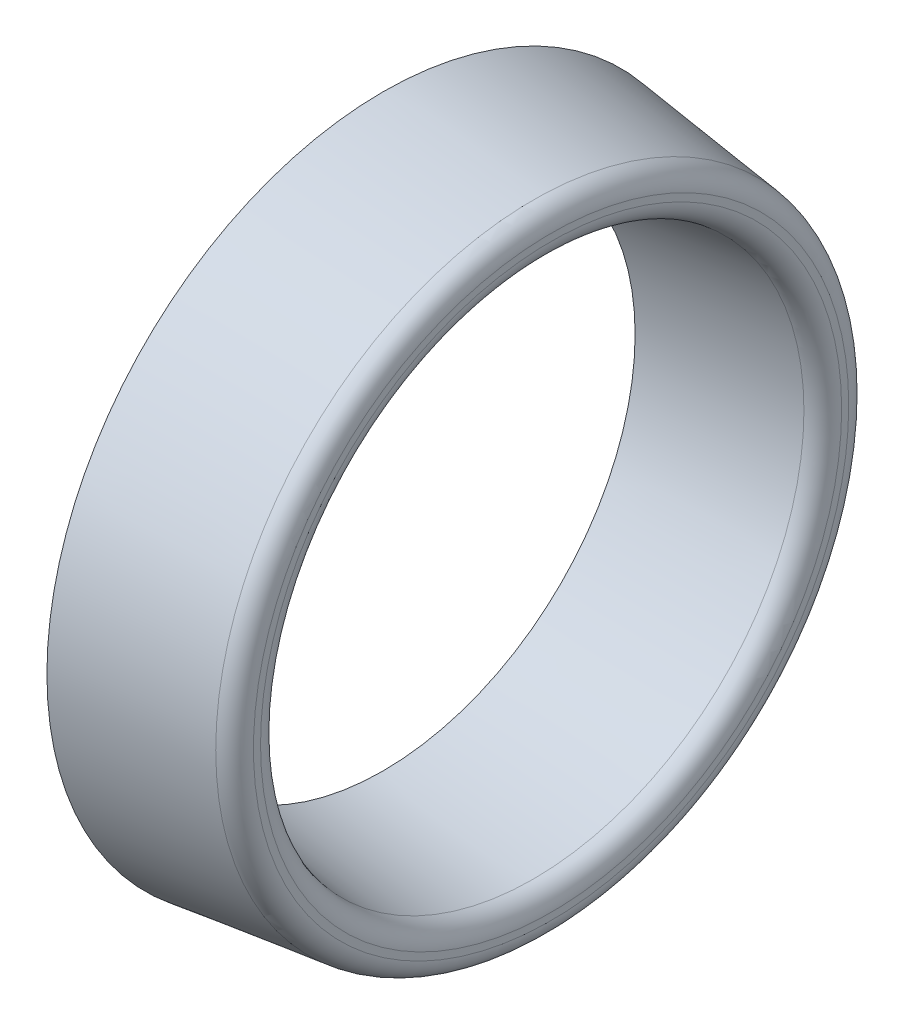
ISO-10303-21;
HEADER;
FILE_DESCRIPTION(('STEP AP214'),'2;1');
FILE_NAME('part.step','',(''),(''),'','','');
FILE_SCHEMA(('AUTOMOTIVE_DESIGN { 1 0 10303 214 1 1 1 1 }'));
ENDSEC;
DATA;
#1=APPLICATION_CONTEXT('core data for automotive mechanical design processes');
#2=APPLICATION_PROTOCOL_DEFINITION('international standard','automotive_design',2000,#1);
#3=PRODUCT_CONTEXT('',#1,'mechanical');
#4=PRODUCT('Part','Part','',(#3));
#5=PRODUCT_RELATED_PRODUCT_CATEGORY('part','',(#4));
#6=PRODUCT_DEFINITION_FORMATION('','',#4);
#7=PRODUCT_DEFINITION_CONTEXT('part definition',#1,'design');
#8=PRODUCT_DEFINITION('design','',#6,#7);
#9=PRODUCT_DEFINITION_SHAPE('','',#8);
#10=(LENGTH_UNIT() NAMED_UNIT(*) SI_UNIT(.MILLI.,.METRE.));
#11=(NAMED_UNIT(*) PLANE_ANGLE_UNIT() SI_UNIT($,.RADIAN.));
#12=(NAMED_UNIT(*) SI_UNIT($,.STERADIAN.) SOLID_ANGLE_UNIT());
#13=UNCERTAINTY_MEASURE_WITH_UNIT(LENGTH_MEASURE(1.E-05),#10,'distance_accuracy_value','');
#14=(GEOMETRIC_REPRESENTATION_CONTEXT(3) GLOBAL_UNCERTAINTY_ASSIGNED_CONTEXT((#13)) GLOBAL_UNIT_ASSIGNED_CONTEXT((#10,
#11,#12)) REPRESENTATION_CONTEXT('',''));
#15=CARTESIAN_POINT('',(0.,0.,0.));
#16=DIRECTION('',(0.,0.,1.));
#17=DIRECTION('',(1.,0.,0.));
#18=AXIS2_PLACEMENT_3D('',#15,#16,#17);
#19=CARTESIAN_POINT('',(0.,0.,0.));
#20=DIRECTION('',(1.,0.,0.));
#21=DIRECTION('',(0.,0.,-1.));
#22=AXIS2_PLACEMENT_3D('',#19,#20,#21);
#23=PLANE('',#22);
#24=CARTESIAN_POINT('',(0.,0.,0.));
#25=DIRECTION('',(1.,0.,0.));
#26=DIRECTION('',(0.,0.,-1.));
#27=AXIS2_PLACEMENT_3D('',#24,#25,#26);
#28=CIRCLE('',#27,4.7625);
#29=CARTESIAN_POINT('',(0.,0.,-4.7625));
#30=VERTEX_POINT('',#29);
#31=EDGE_CURVE('E55',#30,#30,#28,.T.);
#32=ORIENTED_EDGE('',*,*,#31,.T.);
#33=EDGE_LOOP('',(#32));
#34=FACE_BOUND('',#33,.T.);
#35=CARTESIAN_POINT('',(0.,0.,0.));
#36=DIRECTION('',(1.,0.,0.));
#37=DIRECTION('',(0.,0.,-1.));
#38=AXIS2_PLACEMENT_3D('',#35,#36,#37);
#39=CIRCLE('',#38,5.14636124349982);
#40=CARTESIAN_POINT('',(0.,0.,-5.14636124349982));
#41=VERTEX_POINT('',#40);
#42=EDGE_CURVE('E59',#41,#41,#39,.T.);
#43=ORIENTED_EDGE('',*,*,#42,.F.);
#44=EDGE_LOOP('',(#43));
#45=FACE_BOUND('',#44,.T.);
#46=ADVANCED_FACE('F32',(#34,#45),#23,.F.);
#47=CARTESIAN_POINT('',(3.175,0.,0.));
#48=DIRECTION('',(1.,0.,0.));
#49=DIRECTION('',(0.,0.,-1.));
#50=AXIS2_PLACEMENT_3D('',#47,#48,#49);
#51=PLANE('',#50);
#52=CARTESIAN_POINT('',(3.175,0.,0.));
#53=DIRECTION('',(1.,0.,0.));
#54=DIRECTION('',(0.,0.,-1.));
#55=AXIS2_PLACEMENT_3D('',#52,#53,#54);
#56=CIRCLE('',#55,5.48942130666254);
#57=CARTESIAN_POINT('',(3.175,0.,-5.48942130666254));
#58=VERTEX_POINT('',#57);
#59=EDGE_CURVE('E39',#58,#58,#56,.F.);
#60=ORIENTED_EDGE('',*,*,#59,.T.);
#61=EDGE_LOOP('',(#60));
#62=FACE_BOUND('',#61,.T.);
#63=CARTESIAN_POINT('',(3.175,0.,0.));
#64=DIRECTION('',(1.,0.,0.));
#65=DIRECTION('',(0.,0.,-1.));
#66=AXIS2_PLACEMENT_3D('',#63,#64,#65);
#67=CIRCLE('',#66,5.62307869333746);
#68=CARTESIAN_POINT('',(3.175,0.,-5.62307869333746));
#69=VERTEX_POINT('',#68);
#70=EDGE_CURVE('E43',#69,#69,#67,.T.);
#71=ORIENTED_EDGE('',*,*,#70,.T.);
#72=EDGE_LOOP('',(#71));
#73=FACE_BOUND('',#72,.T.);
#74=ADVANCED_FACE('F82',(#62,#73),#51,.T.);
#75=CARTESIAN_POINT('',(0.,0.,0.));
#76=DIRECTION('',(1.,0.,0.));
#77=DIRECTION('',(0.,0.,-1.));
#78=AXIS2_PLACEMENT_3D('',#75,#76,#77);
#79=CIRCLE('',#78,5.96613875650018);
#80=CARTESIAN_POINT('',(0.,0.,-5.96613875650018));
#81=VERTEX_POINT('',#80);
#82=EDGE_CURVE('E62',#81,#81,#79,.T.);
#83=ORIENTED_EDGE('',*,*,#82,.T.);
#84=EDGE_LOOP('',(#83));
#85=FACE_BOUND('',#84,.T.);
#86=CARTESIAN_POINT('',(0.,0.,0.));
#87=DIRECTION('',(1.,0.,0.));
#88=DIRECTION('',(0.,0.,-1.));
#89=AXIS2_PLACEMENT_3D('',#86,#87,#88);
#90=CIRCLE('',#89,6.35);
#91=CARTESIAN_POINT('',(0.,0.,-6.35));
#92=VERTEX_POINT('',#91);
#93=EDGE_CURVE('E52',#92,#92,#90,.T.);
#94=ORIENTED_EDGE('',*,*,#93,.F.);
#95=EDGE_LOOP('',(#94));
#96=FACE_BOUND('',#95,.T.);
#97=ADVANCED_FACE('F85',(#85,#96),#23,.F.);
#98=CARTESIAN_POINT('',(0.,0.,0.));
#99=DIRECTION('',(-1.,0.,0.));
#100=DIRECTION('',(0.,0.,-1.));
#101=AXIS2_PLACEMENT_3D('',#98,#99,#100);
#102=CONICAL_SURFACE('',#101,6.35,0.122173047639603);
#103=CARTESIAN_POINT('',(2.84043221983736,0.,0.));
#104=DIRECTION('',(-1.,0.,0.));
#105=DIRECTION('',(0.,0.,1.));
#106=AXIS2_PLACEMENT_3D('',#103,#104,#105);
#107=CIRCLE('',#106,6.00123877711281);
#108=CARTESIAN_POINT('',(2.84043221983736,0.,6.00123877711281));
#109=VERTEX_POINT('',#108);
#110=EDGE_CURVE('E10',#109,#109,#107,.T.);
#111=ORIENTED_EDGE('',*,*,#110,.T.);
#112=EDGE_LOOP('',(#111));
#113=FACE_BOUND('',#112,.T.);
#114=ORIENTED_EDGE('',*,*,#93,.T.);
#115=EDGE_LOOP('',(#114));
#116=FACE_BOUND('',#115,.T.);
#117=ADVANCED_FACE('F92',(#113,#116),#102,.T.);
#118=CARTESIAN_POINT('',(0.,0.,0.));
#119=DIRECTION('',(1.,0.,0.));
#120=DIRECTION('',(0.,0.,-1.));
#121=AXIS2_PLACEMENT_3D('',#118,#119,#120);
#122=CONICAL_SURFACE('',#121,4.7625,0.122173047639603);
#123=CARTESIAN_POINT('',(2.84043221983736,0.,0.));
#124=DIRECTION('',(-1.,0.,0.));
#125=DIRECTION('',(0.,0.,1.));
#126=AXIS2_PLACEMENT_3D('',#123,#124,#125);
#127=CIRCLE('',#126,5.11126122288719);
#128=CARTESIAN_POINT('',(2.84043221983736,0.,5.11126122288719));
#129=VERTEX_POINT('',#128);
#130=EDGE_CURVE('E47',#129,#129,#127,.F.);
#131=ORIENTED_EDGE('',*,*,#130,.T.);
#132=EDGE_LOOP('',(#131));
#133=FACE_BOUND('',#132,.T.);
#134=ORIENTED_EDGE('',*,*,#31,.F.);
#135=EDGE_LOOP('',(#134));
#136=FACE_BOUND('',#135,.T.);
#137=ADVANCED_FACE('F97',(#133,#136),#122,.F.);
#138=CARTESIAN_POINT('',(2.794,0.,0.));
#139=DIRECTION('',(1.,0.,0.));
#140=DIRECTION('',(0.,0.,-1.));
#141=AXIS2_PLACEMENT_3D('',#138,#139,#140);
#142=TOROIDAL_SURFACE('',#141,5.48942130666254,0.381);
#143=ORIENTED_EDGE('',*,*,#59,.F.);
#144=EDGE_LOOP('',(#143));
#145=FACE_BOUND('',#144,.T.);
#146=ORIENTED_EDGE('',*,*,#130,.F.);
#147=EDGE_LOOP('',(#146));
#148=FACE_BOUND('',#147,.T.);
#149=ADVANCED_FACE('F112',(#145,#148),#142,.T.);
#150=CARTESIAN_POINT('',(2.794,0.,0.));
#151=DIRECTION('',(1.,0.,0.));
#152=DIRECTION('',(0.,0.,-1.));
#153=AXIS2_PLACEMENT_3D('',#150,#151,#152);
#154=TOROIDAL_SURFACE('',#153,5.62307869333746,0.381);
#155=ORIENTED_EDGE('',*,*,#110,.F.);
#156=EDGE_LOOP('',(#155));
#157=FACE_BOUND('',#156,.T.);
#158=ORIENTED_EDGE('',*,*,#70,.F.);
#159=EDGE_LOOP('',(#158));
#160=FACE_BOUND('',#159,.T.);
#161=ADVANCED_FACE('F34',(#157,#160),#154,.T.);
#162=CARTESIAN_POINT('',(2.794,0.,0.));
#163=DIRECTION('',(1.,0.,0.));
#164=DIRECTION('',(0.,0.,-1.));
#165=AXIS2_PLACEMENT_3D('',#162,#163,#164);
#166=PLANE('',#165);
#167=CARTESIAN_POINT('',(2.794,0.,0.));
#168=DIRECTION('',(1.,0.,0.));
#169=DIRECTION('',(0.,0.,-1.));
#170=AXIS2_PLACEMENT_3D('',#167,#168,#169);
#171=CIRCLE('',#170,5.48942130666254);
#172=CARTESIAN_POINT('',(2.794,0.,-5.48942130666254));
#173=VERTEX_POINT('',#172);
#174=EDGE_CURVE('E65',#173,#173,#171,.T.);
#175=ORIENTED_EDGE('',*,*,#174,.T.);
#176=EDGE_LOOP('',(#175));
#177=FACE_BOUND('',#176,.T.);
#178=CARTESIAN_POINT('',(2.794,0.,0.));
#179=DIRECTION('',(1.,0.,0.));
#180=DIRECTION('',(0.,0.,-1.));
#181=AXIS2_PLACEMENT_3D('',#178,#179,#180);
#182=CIRCLE('',#181,5.62307869333746);
#183=CARTESIAN_POINT('',(2.794,0.,-5.62307869333746));
#184=VERTEX_POINT('',#183);
#185=EDGE_CURVE('E58',#184,#184,#182,.T.);
#186=ORIENTED_EDGE('',*,*,#185,.F.);
#187=EDGE_LOOP('',(#186));
#188=FACE_BOUND('',#187,.T.);
#189=ADVANCED_FACE('F71',(#177,#188),#166,.F.);
#190=CARTESIAN_POINT('',(-0.0464322198373613,0.,0.));
#191=DIRECTION('',(-1.,0.,0.));
#192=DIRECTION('',(0.,0.,-1.));
#193=AXIS2_PLACEMENT_3D('',#190,#191,#192);
#194=CONICAL_SURFACE('',#193,5.97183991622466,0.122173047639603);
#195=ORIENTED_EDGE('',*,*,#185,.T.);
#196=EDGE_LOOP('',(#195));
#197=FACE_BOUND('',#196,.T.);
#198=ORIENTED_EDGE('',*,*,#82,.F.);
#199=EDGE_LOOP('',(#198));
#200=FACE_BOUND('',#199,.T.);
#201=ADVANCED_FACE('F77',(#197,#200),#194,.F.);
#202=CARTESIAN_POINT('',(-0.0464322198373613,0.,0.));
#203=DIRECTION('',(1.,0.,0.));
#204=DIRECTION('',(0.,0.,-1.));
#205=AXIS2_PLACEMENT_3D('',#202,#203,#204);
#206=CONICAL_SURFACE('',#205,5.14066008377534,0.122173047639603);
#207=ORIENTED_EDGE('',*,*,#174,.F.);
#208=EDGE_LOOP('',(#207));
#209=FACE_BOUND('',#208,.T.);
#210=ORIENTED_EDGE('',*,*,#42,.T.);
#211=EDGE_LOOP('',(#210));
#212=FACE_BOUND('',#211,.T.);
#213=ADVANCED_FACE('F74',(#209,#212),#206,.T.);
#214=CLOSED_SHELL('',(#46,#74,#97,#117,#137,#149,#161,#189,#201,#213));
#215=MANIFOLD_SOLID_BREP('B2',#214);
#216=ADVANCED_BREP_SHAPE_REPRESENTATION('',(#18,#215),#14);
#217=SHAPE_DEFINITION_REPRESENTATION(#9,#216);
ENDSEC;
END-ISO-10303-21;
